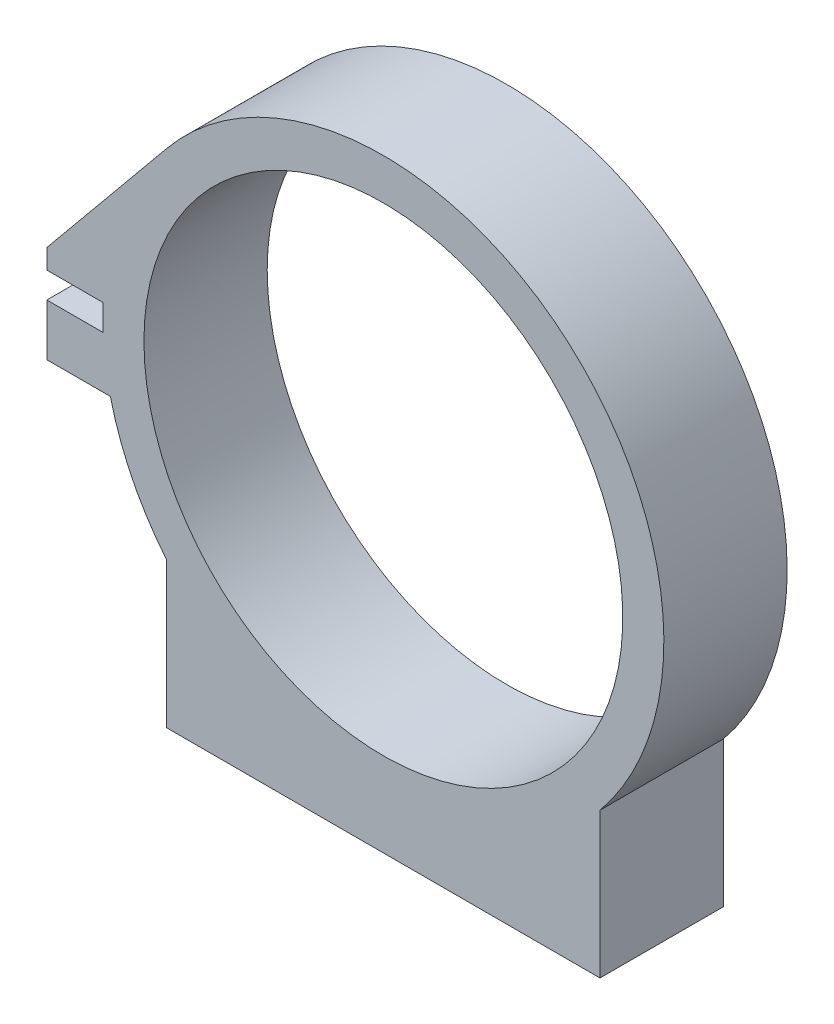
ISO-10303-21;
HEADER;
FILE_DESCRIPTION(('STEP AP214'),'2;1');
FILE_NAME('part.step','',(''),(''),'','','');
FILE_SCHEMA(('AUTOMOTIVE_DESIGN { 1 0 10303 214 1 1 1 1 }'));
ENDSEC;
DATA;
#1=APPLICATION_CONTEXT('core data for automotive mechanical design processes');
#2=APPLICATION_PROTOCOL_DEFINITION('international standard','automotive_design',2000,#1);
#3=PRODUCT_CONTEXT('',#1,'mechanical');
#4=PRODUCT('Part','Part','',(#3));
#5=PRODUCT_RELATED_PRODUCT_CATEGORY('part','',(#4));
#6=PRODUCT_DEFINITION_FORMATION('','',#4);
#7=PRODUCT_DEFINITION_CONTEXT('part definition',#1,'design');
#8=PRODUCT_DEFINITION('design','',#6,#7);
#9=PRODUCT_DEFINITION_SHAPE('','',#8);
#10=(LENGTH_UNIT() NAMED_UNIT(*) SI_UNIT(.MILLI.,.METRE.));
#11=(NAMED_UNIT(*) PLANE_ANGLE_UNIT() SI_UNIT($,.RADIAN.));
#12=(NAMED_UNIT(*) SI_UNIT($,.STERADIAN.) SOLID_ANGLE_UNIT());
#13=UNCERTAINTY_MEASURE_WITH_UNIT(LENGTH_MEASURE(1.E-05),#10,'distance_accuracy_value','');
#14=(GEOMETRIC_REPRESENTATION_CONTEXT(3) GLOBAL_UNCERTAINTY_ASSIGNED_CONTEXT((#13)) GLOBAL_UNIT_ASSIGNED_CONTEXT((#10,
#11,#12)) REPRESENTATION_CONTEXT('',''));
#15=CARTESIAN_POINT('',(0.,0.,0.));
#16=DIRECTION('',(0.,0.,1.));
#17=DIRECTION('',(1.,0.,0.));
#18=AXIS2_PLACEMENT_3D('',#15,#16,#17);
#19=CARTESIAN_POINT('',(0.,0.,9.525));
#20=DIRECTION('',(0.,0.,1.));
#21=DIRECTION('',(1.,0.,0.));
#22=AXIS2_PLACEMENT_3D('',#19,#20,#21);
#23=PLANE('',#22);
#24=CARTESIAN_POINT('',(0.,0.,9.525));
#25=DIRECTION('',(0.,0.,1.));
#26=DIRECTION('',(1.,0.,0.));
#27=AXIS2_PLACEMENT_3D('',#24,#25,#26);
#28=CIRCLE('',#27,21.675);
#29=CARTESIAN_POINT('',(-21.6519196608522,1.,9.525));
#30=VERTEX_POINT('',#29);
#31=CARTESIAN_POINT('',(-21.6519196608522,-1.,9.525));
#32=VERTEX_POINT('',#31);
#33=EDGE_CURVE('E178',#30,#32,#28,.T.);
#34=ORIENTED_EDGE('',*,*,#33,.T.);
#35=DIRECTION('',(-1.,0.,0.));
#36=VECTOR('',#35,1.);
#37=CARTESIAN_POINT('',(-26.,-1.,9.525));
#38=LINE('',#37,#36);
#39=CARTESIAN_POINT('',(-26.,-1.,9.525));
#40=VERTEX_POINT('',#39);
#41=EDGE_CURVE('E106',#32,#40,#38,.T.);
#42=ORIENTED_EDGE('',*,*,#41,.T.);
#43=DIRECTION('',(0.,-1.,0.));
#44=VECTOR('',#43,1.);
#45=CARTESIAN_POINT('',(-26.,-1.,9.525));
#46=LINE('',#45,#44);
#47=CARTESIAN_POINT('',(-26.,-5.,9.525));
#48=VERTEX_POINT('',#47);
#49=EDGE_CURVE('E206',#40,#48,#46,.T.);
#50=ORIENTED_EDGE('',*,*,#49,.T.);
#51=DIRECTION('',(1.,0.,0.));
#52=VECTOR('',#51,1.);
#53=CARTESIAN_POINT('',(-26.,-5.,9.525));
#54=LINE('',#53,#52);
#55=CARTESIAN_POINT('',(-21.0904154771783,-5.,9.525));
#56=VERTEX_POINT('',#55);
#57=EDGE_CURVE('E225',#48,#56,#54,.T.);
#58=ORIENTED_EDGE('',*,*,#57,.T.);
#59=CARTESIAN_POINT('',(0.,0.,9.525));
#60=DIRECTION('',(0.,0.,1.));
#61=DIRECTION('',(1.,0.,0.));
#62=AXIS2_PLACEMENT_3D('',#59,#60,#61);
#63=CIRCLE('',#62,21.675);
#64=CARTESIAN_POINT('',(-16.7386,-13.7704355428577,9.525));
#65=VERTEX_POINT('',#64);
#66=EDGE_CURVE('E222',#56,#65,#63,.T.);
#67=ORIENTED_EDGE('',*,*,#66,.T.);
#68=DIRECTION('',(0.,-1.,0.));
#69=VECTOR('',#68,1.);
#70=CARTESIAN_POINT('',(-16.7386,-13.7704355428577,9.525));
#71=LINE('',#70,#69);
#72=CARTESIAN_POINT('',(-16.7386,-25.,9.525));
#73=VERTEX_POINT('',#72);
#74=EDGE_CURVE('E224',#65,#73,#71,.T.);
#75=ORIENTED_EDGE('',*,*,#74,.T.);
#76=DIRECTION('',(1.,0.,0.));
#77=VECTOR('',#76,1.);
#78=CARTESIAN_POINT('',(-16.7386,-25.,9.525));
#79=LINE('',#78,#77);
#80=CARTESIAN_POINT('',(16.7386,-25.,9.525));
#81=VERTEX_POINT('',#80);
#82=EDGE_CURVE('E227',#73,#81,#79,.T.);
#83=ORIENTED_EDGE('',*,*,#82,.T.);
#84=DIRECTION('',(0.,1.,0.));
#85=VECTOR('',#84,1.);
#86=CARTESIAN_POINT('',(16.7386,-25.,9.525));
#87=LINE('',#86,#85);
#88=CARTESIAN_POINT('',(16.7386,-13.7704355428577,9.525));
#89=VERTEX_POINT('',#88);
#90=EDGE_CURVE('E233',#81,#89,#87,.T.);
#91=ORIENTED_EDGE('',*,*,#90,.T.);
#92=CARTESIAN_POINT('',(0.,0.,9.525));
#93=DIRECTION('',(0.,0.,1.));
#94=DIRECTION('',(1.,0.,0.));
#95=AXIS2_PLACEMENT_3D('',#92,#93,#94);
#96=CIRCLE('',#95,21.675);
#97=CARTESIAN_POINT('',(-16.7386,13.7704355428577,9.525));
#98=VERTEX_POINT('',#97);
#99=EDGE_CURVE('E137',#89,#98,#96,.T.);
#100=ORIENTED_EDGE('',*,*,#99,.T.);
#101=DIRECTION('',(-0.635314211896551,-0.772253748558247,0.));
#102=VECTOR('',#101,1.);
#103=CARTESIAN_POINT('',(-16.7386,13.7704355428577,9.525));
#104=LINE('',#103,#102);
#105=CARTESIAN_POINT('',(-26.,2.51277636733478,9.525));
#106=VERTEX_POINT('',#105);
#107=EDGE_CURVE('E131',#98,#106,#104,.T.);
#108=ORIENTED_EDGE('',*,*,#107,.T.);
#109=DIRECTION('',(0.,-1.,0.));
#110=VECTOR('',#109,1.);
#111=CARTESIAN_POINT('',(-26.,2.51277636733478,9.525));
#112=LINE('',#111,#110);
#113=CARTESIAN_POINT('',(-26.,1.,9.525));
#114=VERTEX_POINT('',#113);
#115=EDGE_CURVE('E135',#106,#114,#112,.T.);
#116=ORIENTED_EDGE('',*,*,#115,.T.);
#117=DIRECTION('',(1.,0.,0.));
#118=VECTOR('',#117,1.);
#119=CARTESIAN_POINT('',(-26.,1.,9.525));
#120=LINE('',#119,#118);
#121=EDGE_CURVE('E51',#114,#30,#120,.T.);
#122=ORIENTED_EDGE('',*,*,#121,.T.);
#123=EDGE_LOOP('',(#34,#42,#50,#58,#67,#75,#83,#91,#100,#108,#116,#122));
#124=FACE_BOUND('',#123,.T.);
#125=CARTESIAN_POINT('',(0.,0.,9.525));
#126=DIRECTION('',(0.,0.,1.));
#127=DIRECTION('',(1.,0.,0.));
#128=AXIS2_PLACEMENT_3D('',#125,#126,#127);
#129=CIRCLE('',#128,18.5);
#130=CARTESIAN_POINT('',(-18.5,0.,9.525));
#131=VERTEX_POINT('',#130);
#132=EDGE_CURVE('E159',#131,#131,#129,.T.);
#133=ORIENTED_EDGE('',*,*,#132,.F.);
#134=EDGE_LOOP('',(#133));
#135=FACE_BOUND('',#134,.T.);
#136=ADVANCED_FACE('F33',(#124,#135),#23,.T.);
#137=CARTESIAN_POINT('',(0.,0.,0.));
#138=DIRECTION('',(0.,0.,1.));
#139=DIRECTION('',(1.,0.,0.));
#140=AXIS2_PLACEMENT_3D('',#137,#138,#139);
#141=PLANE('',#140);
#142=CARTESIAN_POINT('',(0.,0.,0.));
#143=DIRECTION('',(0.,0.,1.));
#144=DIRECTION('',(1.,0.,0.));
#145=AXIS2_PLACEMENT_3D('',#142,#143,#144);
#146=CIRCLE('',#145,21.675);
#147=CARTESIAN_POINT('',(-21.6519196608522,1.,0.));
#148=VERTEX_POINT('',#147);
#149=CARTESIAN_POINT('',(-21.6519196608522,-1.,0.));
#150=VERTEX_POINT('',#149);
#151=EDGE_CURVE('E155',#148,#150,#146,.T.);
#152=ORIENTED_EDGE('',*,*,#151,.F.);
#153=DIRECTION('',(1.,0.,0.));
#154=VECTOR('',#153,1.);
#155=CARTESIAN_POINT('',(-26.,1.,0.));
#156=LINE('',#155,#154);
#157=CARTESIAN_POINT('',(-26.,1.,0.));
#158=VERTEX_POINT('',#157);
#159=EDGE_CURVE('E98',#158,#148,#156,.T.);
#160=ORIENTED_EDGE('',*,*,#159,.F.);
#161=DIRECTION('',(0.,-1.,0.));
#162=VECTOR('',#161,1.);
#163=CARTESIAN_POINT('',(-26.,2.51277636733478,0.));
#164=LINE('',#163,#162);
#165=CARTESIAN_POINT('',(-26.,2.51277636733478,0.));
#166=VERTEX_POINT('',#165);
#167=EDGE_CURVE('E92',#166,#158,#164,.T.);
#168=ORIENTED_EDGE('',*,*,#167,.F.);
#169=DIRECTION('',(-0.635314211896551,-0.772253748558247,0.));
#170=VECTOR('',#169,1.);
#171=CARTESIAN_POINT('',(-16.7386,13.7704355428577,0.));
#172=LINE('',#171,#170);
#173=CARTESIAN_POINT('',(-16.7386,13.7704355428577,0.));
#174=VERTEX_POINT('',#173);
#175=EDGE_CURVE('E145',#174,#166,#172,.T.);
#176=ORIENTED_EDGE('',*,*,#175,.F.);
#177=CARTESIAN_POINT('',(0.,0.,0.));
#178=DIRECTION('',(0.,0.,1.));
#179=DIRECTION('',(1.,0.,0.));
#180=AXIS2_PLACEMENT_3D('',#177,#178,#179);
#181=CIRCLE('',#180,21.675);
#182=CARTESIAN_POINT('',(16.7386,-13.7704355428577,0.));
#183=VERTEX_POINT('',#182);
#184=EDGE_CURVE('E173',#183,#174,#181,.T.);
#185=ORIENTED_EDGE('',*,*,#184,.F.);
#186=DIRECTION('',(0.,1.,0.));
#187=VECTOR('',#186,1.);
#188=CARTESIAN_POINT('',(16.7386,-25.,0.));
#189=LINE('',#188,#187);
#190=CARTESIAN_POINT('',(16.7386,-25.,0.));
#191=VERTEX_POINT('',#190);
#192=EDGE_CURVE('E171',#191,#183,#189,.T.);
#193=ORIENTED_EDGE('',*,*,#192,.F.);
#194=DIRECTION('',(1.,0.,0.));
#195=VECTOR('',#194,1.);
#196=CARTESIAN_POINT('',(-16.7386,-25.,0.));
#197=LINE('',#196,#195);
#198=CARTESIAN_POINT('',(-16.7386,-25.,0.));
#199=VERTEX_POINT('',#198);
#200=EDGE_CURVE('E169',#199,#191,#197,.T.);
#201=ORIENTED_EDGE('',*,*,#200,.F.);
#202=DIRECTION('',(0.,-1.,0.));
#203=VECTOR('',#202,1.);
#204=CARTESIAN_POINT('',(-16.7386,-13.7704355428577,0.));
#205=LINE('',#204,#203);
#206=CARTESIAN_POINT('',(-16.7386,-13.7704355428577,0.));
#207=VERTEX_POINT('',#206);
#208=EDGE_CURVE('E167',#207,#199,#205,.T.);
#209=ORIENTED_EDGE('',*,*,#208,.F.);
#210=CARTESIAN_POINT('',(0.,0.,0.));
#211=DIRECTION('',(0.,0.,1.));
#212=DIRECTION('',(1.,0.,0.));
#213=AXIS2_PLACEMENT_3D('',#210,#211,#212);
#214=CIRCLE('',#213,21.675);
#215=CARTESIAN_POINT('',(-21.0904154771783,-5.,0.));
#216=VERTEX_POINT('',#215);
#217=EDGE_CURVE('E165',#216,#207,#214,.T.);
#218=ORIENTED_EDGE('',*,*,#217,.F.);
#219=DIRECTION('',(1.,0.,0.));
#220=VECTOR('',#219,1.);
#221=CARTESIAN_POINT('',(-26.,-5.,0.));
#222=LINE('',#221,#220);
#223=CARTESIAN_POINT('',(-26.,-5.,0.));
#224=VERTEX_POINT('',#223);
#225=EDGE_CURVE('E163',#224,#216,#222,.T.);
#226=ORIENTED_EDGE('',*,*,#225,.F.);
#227=DIRECTION('',(0.,-1.,0.));
#228=VECTOR('',#227,1.);
#229=CARTESIAN_POINT('',(-26.,-1.,0.));
#230=LINE('',#229,#228);
#231=CARTESIAN_POINT('',(-26.,-1.,0.));
#232=VERTEX_POINT('',#231);
#233=EDGE_CURVE('E161',#232,#224,#230,.T.);
#234=ORIENTED_EDGE('',*,*,#233,.F.);
#235=DIRECTION('',(-1.,0.,0.));
#236=VECTOR('',#235,1.);
#237=CARTESIAN_POINT('',(-26.,-1.,0.));
#238=LINE('',#237,#236);
#239=EDGE_CURVE('E158',#150,#232,#238,.T.);
#240=ORIENTED_EDGE('',*,*,#239,.F.);
#241=EDGE_LOOP('',(#152,#160,#168,#176,#185,#193,#201,#209,#218,#226,#234,#240));
#242=FACE_BOUND('',#241,.T.);
#243=CARTESIAN_POINT('',(0.,0.,0.));
#244=DIRECTION('',(0.,0.,1.));
#245=DIRECTION('',(1.,0.,0.));
#246=AXIS2_PLACEMENT_3D('',#243,#244,#245);
#247=CIRCLE('',#246,18.5);
#248=CARTESIAN_POINT('',(-18.5,0.,0.));
#249=VERTEX_POINT('',#248);
#250=EDGE_CURVE('E311',#249,#249,#247,.T.);
#251=ORIENTED_EDGE('',*,*,#250,.T.);
#252=EDGE_LOOP('',(#251));
#253=FACE_BOUND('',#252,.T.);
#254=ADVANCED_FACE('F210',(#242,#253),#141,.F.);
#255=CARTESIAN_POINT('',(0.,0.,9.525));
#256=DIRECTION('',(0.,0.,-1.));
#257=DIRECTION('',(-1.,0.,0.));
#258=AXIS2_PLACEMENT_3D('',#255,#256,#257);
#259=CYLINDRICAL_SURFACE('',#258,21.675);
#260=ORIENTED_EDGE('',*,*,#151,.T.);
#261=DIRECTION('',(0.,0.,-1.));
#262=VECTOR('',#261,1.);
#263=CARTESIAN_POINT('',(-21.6519196608522,-1.,9.525));
#264=LINE('',#263,#262);
#265=EDGE_CURVE('E11',#32,#150,#264,.T.);
#266=ORIENTED_EDGE('',*,*,#265,.F.);
#267=ORIENTED_EDGE('',*,*,#33,.F.);
#268=DIRECTION('',(0.,0.,-1.));
#269=VECTOR('',#268,1.);
#270=CARTESIAN_POINT('',(-21.6519196608522,1.,9.525));
#271=LINE('',#270,#269);
#272=EDGE_CURVE('E151',#30,#148,#271,.T.);
#273=ORIENTED_EDGE('',*,*,#272,.T.);
#274=EDGE_LOOP('',(#260,#266,#267,#273));
#275=FACE_BOUND('',#274,.T.);
#276=ADVANCED_FACE('F35',(#275),#259,.T.);
#277=CARTESIAN_POINT('',(-26.,-1.,9.525));
#278=DIRECTION('',(0.,-1.,0.));
#279=DIRECTION('',(0.,0.,-1.));
#280=AXIS2_PLACEMENT_3D('',#277,#278,#279);
#281=PLANE('',#280);
#282=CARTESIAN_POINT('',(-23.5452077385891,-1.,4.7625));
#283=DIRECTION('',(0.,-1.,0.));
#284=DIRECTION('',(0.,0.,-1.));
#285=AXIS2_PLACEMENT_3D('',#282,#283,#284);
#286=CIRCLE('',#285,1.3890625);
#287=CARTESIAN_POINT('',(-23.5452077385891,-1.,3.3734375));
#288=VERTEX_POINT('',#287);
#289=EDGE_CURVE('E297',#288,#288,#286,.T.);
#290=ORIENTED_EDGE('',*,*,#289,.T.);
#291=EDGE_LOOP('',(#290));
#292=FACE_BOUND('',#291,.T.);
#293=ORIENTED_EDGE('',*,*,#239,.T.);
#294=DIRECTION('',(0.,0.,-1.));
#295=VECTOR('',#294,1.);
#296=CARTESIAN_POINT('',(-26.,-1.,9.525));
#297=LINE('',#296,#295);
#298=EDGE_CURVE('E43',#40,#232,#297,.T.);
#299=ORIENTED_EDGE('',*,*,#298,.F.);
#300=ORIENTED_EDGE('',*,*,#41,.F.);
#301=ORIENTED_EDGE('',*,*,#265,.T.);
#302=EDGE_LOOP('',(#293,#299,#300,#301));
#303=FACE_BOUND('',#302,.T.);
#304=ADVANCED_FACE('F350',(#292,#303),#281,.F.);
#305=CARTESIAN_POINT('',(-26.,-1.,9.525));
#306=DIRECTION('',(1.,0.,0.));
#307=DIRECTION('',(0.,0.,-1.));
#308=AXIS2_PLACEMENT_3D('',#305,#306,#307);
#309=PLANE('',#308);
#310=ORIENTED_EDGE('',*,*,#233,.T.);
#311=DIRECTION('',(0.,0.,-1.));
#312=VECTOR('',#311,1.);
#313=CARTESIAN_POINT('',(-26.,-5.,9.525));
#314=LINE('',#313,#312);
#315=EDGE_CURVE('E197',#48,#224,#314,.T.);
#316=ORIENTED_EDGE('',*,*,#315,.F.);
#317=ORIENTED_EDGE('',*,*,#49,.F.);
#318=ORIENTED_EDGE('',*,*,#298,.T.);
#319=EDGE_LOOP('',(#310,#316,#317,#318));
#320=FACE_BOUND('',#319,.T.);
#321=ADVANCED_FACE('F204',(#320),#309,.F.);
#322=CARTESIAN_POINT('',(-26.,-5.,9.525));
#323=DIRECTION('',(0.,1.,0.));
#324=DIRECTION('',(0.,0.,1.));
#325=AXIS2_PLACEMENT_3D('',#322,#323,#324);
#326=PLANE('',#325);
#327=CARTESIAN_POINT('',(-23.5452077385891,-5.,4.7625));
#328=DIRECTION('',(0.,-1.,0.));
#329=DIRECTION('',(0.,0.,-1.));
#330=AXIS2_PLACEMENT_3D('',#327,#328,#329);
#331=CIRCLE('',#330,1.3890625);
#332=CARTESIAN_POINT('',(-23.5452077385891,-5.,3.3734375));
#333=VERTEX_POINT('',#332);
#334=EDGE_CURVE('E294',#333,#333,#331,.T.);
#335=ORIENTED_EDGE('',*,*,#334,.F.);
#336=EDGE_LOOP('',(#335));
#337=FACE_BOUND('',#336,.T.);
#338=ORIENTED_EDGE('',*,*,#225,.T.);
#339=DIRECTION('',(0.,0.,-1.));
#340=VECTOR('',#339,1.);
#341=CARTESIAN_POINT('',(-21.0904154771783,-5.,9.525));
#342=LINE('',#341,#340);
#343=EDGE_CURVE('E194',#56,#216,#342,.T.);
#344=ORIENTED_EDGE('',*,*,#343,.F.);
#345=ORIENTED_EDGE('',*,*,#57,.F.);
#346=ORIENTED_EDGE('',*,*,#315,.T.);
#347=EDGE_LOOP('',(#338,#344,#345,#346));
#348=FACE_BOUND('',#347,.T.);
#349=ADVANCED_FACE('F216',(#337,#348),#326,.F.);
#350=CARTESIAN_POINT('',(0.,0.,9.525));
#351=DIRECTION('',(0.,0.,-1.));
#352=DIRECTION('',(-1.,0.,0.));
#353=AXIS2_PLACEMENT_3D('',#350,#351,#352);
#354=CYLINDRICAL_SURFACE('',#353,21.675);
#355=ORIENTED_EDGE('',*,*,#217,.T.);
#356=DIRECTION('',(0.,0.,-1.));
#357=VECTOR('',#356,1.);
#358=CARTESIAN_POINT('',(-16.7386,-13.7704355428577,9.525));
#359=LINE('',#358,#357);
#360=EDGE_CURVE('E191',#65,#207,#359,.T.);
#361=ORIENTED_EDGE('',*,*,#360,.F.);
#362=ORIENTED_EDGE('',*,*,#66,.F.);
#363=ORIENTED_EDGE('',*,*,#343,.T.);
#364=EDGE_LOOP('',(#355,#361,#362,#363));
#365=FACE_BOUND('',#364,.T.);
#366=ADVANCED_FACE('F220',(#365),#354,.T.);
#367=CARTESIAN_POINT('',(-16.7386,-13.7704355428577,9.525));
#368=DIRECTION('',(1.,0.,0.));
#369=DIRECTION('',(0.,1.,0.));
#370=AXIS2_PLACEMENT_3D('',#367,#368,#369);
#371=PLANE('',#370);
#372=ORIENTED_EDGE('',*,*,#208,.T.);
#373=DIRECTION('',(0.,0.,-1.));
#374=VECTOR('',#373,1.);
#375=CARTESIAN_POINT('',(-16.7386,-25.,9.525));
#376=LINE('',#375,#374);
#377=EDGE_CURVE('E188',#73,#199,#376,.T.);
#378=ORIENTED_EDGE('',*,*,#377,.F.);
#379=ORIENTED_EDGE('',*,*,#74,.F.);
#380=ORIENTED_EDGE('',*,*,#360,.T.);
#381=EDGE_LOOP('',(#372,#378,#379,#380));
#382=FACE_BOUND('',#381,.T.);
#383=ADVANCED_FACE('F332',(#382),#371,.F.);
#384=CARTESIAN_POINT('',(-16.7386,-25.,9.525));
#385=DIRECTION('',(0.,1.,0.));
#386=DIRECTION('',(0.,0.,1.));
#387=AXIS2_PLACEMENT_3D('',#384,#385,#386);
#388=PLANE('',#387);
#389=CARTESIAN_POINT('',(-13.4747,-25.,4.7625));
#390=DIRECTION('',(0.,-1.,0.));
#391=DIRECTION('',(0.,0.,-1.));
#392=AXIS2_PLACEMENT_3D('',#389,#390,#391);
#393=CIRCLE('',#392,1.3890625);
#394=CARTESIAN_POINT('',(-13.4747,-25.,3.3734375));
#395=VERTEX_POINT('',#394);
#396=EDGE_CURVE('E312',#395,#395,#393,.T.);
#397=ORIENTED_EDGE('',*,*,#396,.F.);
#398=EDGE_LOOP('',(#397));
#399=FACE_BOUND('',#398,.T.);
#400=CARTESIAN_POINT('',(13.4747,-25.,4.7625));
#401=DIRECTION('',(0.,-1.,0.));
#402=DIRECTION('',(0.,0.,-1.));
#403=AXIS2_PLACEMENT_3D('',#400,#401,#402);
#404=CIRCLE('',#403,1.3890625);
#405=CARTESIAN_POINT('',(13.4747,-25.,3.3734375));
#406=VERTEX_POINT('',#405);
#407=EDGE_CURVE('E299',#406,#406,#404,.T.);
#408=ORIENTED_EDGE('',*,*,#407,.F.);
#409=EDGE_LOOP('',(#408));
#410=FACE_BOUND('',#409,.T.);
#411=ORIENTED_EDGE('',*,*,#200,.T.);
#412=DIRECTION('',(0.,0.,-1.));
#413=VECTOR('',#412,1.);
#414=CARTESIAN_POINT('',(16.7386,-25.,9.525));
#415=LINE('',#414,#413);
#416=EDGE_CURVE('E185',#81,#191,#415,.T.);
#417=ORIENTED_EDGE('',*,*,#416,.F.);
#418=ORIENTED_EDGE('',*,*,#82,.F.);
#419=ORIENTED_EDGE('',*,*,#377,.T.);
#420=EDGE_LOOP('',(#411,#417,#418,#419));
#421=FACE_BOUND('',#420,.T.);
#422=ADVANCED_FACE('F329',(#399,#410,#421),#388,.F.);
#423=CARTESIAN_POINT('',(16.7386,-25.,9.525));
#424=DIRECTION('',(-1.,0.,0.));
#425=DIRECTION('',(0.,-1.,0.));
#426=AXIS2_PLACEMENT_3D('',#423,#424,#425);
#427=PLANE('',#426);
#428=ORIENTED_EDGE('',*,*,#192,.T.);
#429=DIRECTION('',(0.,0.,-1.));
#430=VECTOR('',#429,1.);
#431=CARTESIAN_POINT('',(16.7386,-13.7704355428577,9.525));
#432=LINE('',#431,#430);
#433=EDGE_CURVE('E182',#89,#183,#432,.T.);
#434=ORIENTED_EDGE('',*,*,#433,.F.);
#435=ORIENTED_EDGE('',*,*,#90,.F.);
#436=ORIENTED_EDGE('',*,*,#416,.T.);
#437=EDGE_LOOP('',(#428,#434,#435,#436));
#438=FACE_BOUND('',#437,.T.);
#439=ADVANCED_FACE('F239',(#438),#427,.F.);
#440=CARTESIAN_POINT('',(0.,0.,9.525));
#441=DIRECTION('',(0.,0.,-1.));
#442=DIRECTION('',(-1.,0.,0.));
#443=AXIS2_PLACEMENT_3D('',#440,#441,#442);
#444=CYLINDRICAL_SURFACE('',#443,21.675);
#445=ORIENTED_EDGE('',*,*,#184,.T.);
#446=DIRECTION('',(0.,0.,-1.));
#447=VECTOR('',#446,1.);
#448=CARTESIAN_POINT('',(-16.7386,13.7704355428577,9.525));
#449=LINE('',#448,#447);
#450=EDGE_CURVE('E146',#98,#174,#449,.T.);
#451=ORIENTED_EDGE('',*,*,#450,.F.);
#452=ORIENTED_EDGE('',*,*,#99,.F.);
#453=ORIENTED_EDGE('',*,*,#433,.T.);
#454=EDGE_LOOP('',(#445,#451,#452,#453));
#455=FACE_BOUND('',#454,.T.);
#456=ADVANCED_FACE('F243',(#455),#444,.T.);
#457=CARTESIAN_POINT('',(-16.7386,13.7704355428577,9.525));
#458=DIRECTION('',(0.772253748558247,-0.635314211896551,0.));
#459=DIRECTION('',(0.635314211896551,0.772253748558247,0.));
#460=AXIS2_PLACEMENT_3D('',#457,#458,#459);
#461=PLANE('',#460);
#462=CARTESIAN_POINT('',(-23.5452077385891,5.49668966615299,4.7625));
#463=DIRECTION('',(0.772253748558247,-0.635314211896551,0.));
#464=DIRECTION('',(-0.635314211896551,-0.772253748558247,0.));
#465=AXIS2_PLACEMENT_3D('',#462,#463,#464);
#466=ELLIPSE('',#465,2.18641811246965,1.3890625);
#467=CARTESIAN_POINT('',(-24.9342702385891,3.80822008288265,4.7625));
#468=VERTEX_POINT('',#467);
#469=EDGE_CURVE('E304',#468,#468,#466,.F.);
#470=ORIENTED_EDGE('',*,*,#469,.F.);
#471=EDGE_LOOP('',(#470));
#472=FACE_BOUND('',#471,.T.);
#473=ORIENTED_EDGE('',*,*,#175,.T.);
#474=DIRECTION('',(0.,0.,-1.));
#475=VECTOR('',#474,1.);
#476=CARTESIAN_POINT('',(-26.,2.51277636733478,9.525));
#477=LINE('',#476,#475);
#478=EDGE_CURVE('E142',#106,#166,#477,.T.);
#479=ORIENTED_EDGE('',*,*,#478,.F.);
#480=ORIENTED_EDGE('',*,*,#107,.F.);
#481=ORIENTED_EDGE('',*,*,#450,.T.);
#482=EDGE_LOOP('',(#473,#479,#480,#481));
#483=FACE_BOUND('',#482,.T.);
#484=ADVANCED_FACE('F143',(#472,#483),#461,.F.);
#485=CARTESIAN_POINT('',(-26.,2.51277636733478,9.525));
#486=DIRECTION('',(1.,0.,0.));
#487=DIRECTION('',(0.,0.,-1.));
#488=AXIS2_PLACEMENT_3D('',#485,#486,#487);
#489=PLANE('',#488);
#490=ORIENTED_EDGE('',*,*,#167,.T.);
#491=DIRECTION('',(0.,0.,-1.));
#492=VECTOR('',#491,1.);
#493=CARTESIAN_POINT('',(-26.,1.,9.525));
#494=LINE('',#493,#492);
#495=EDGE_CURVE('E147',#114,#158,#494,.T.);
#496=ORIENTED_EDGE('',*,*,#495,.F.);
#497=ORIENTED_EDGE('',*,*,#115,.F.);
#498=ORIENTED_EDGE('',*,*,#478,.T.);
#499=EDGE_LOOP('',(#490,#496,#497,#498));
#500=FACE_BOUND('',#499,.T.);
#501=ADVANCED_FACE('F149',(#500),#489,.F.);
#502=CARTESIAN_POINT('',(-26.,1.,9.525));
#503=DIRECTION('',(0.,1.,0.));
#504=DIRECTION('',(0.,0.,1.));
#505=AXIS2_PLACEMENT_3D('',#502,#503,#504);
#506=PLANE('',#505);
#507=CARTESIAN_POINT('',(-23.5452077385891,1.,4.7625));
#508=DIRECTION('',(0.,1.,0.));
#509=DIRECTION('',(0.,0.,1.));
#510=AXIS2_PLACEMENT_3D('',#507,#508,#509);
#511=CIRCLE('',#510,1.3890625);
#512=CARTESIAN_POINT('',(-23.5452077385891,1.,6.1515625));
#513=VERTEX_POINT('',#512);
#514=EDGE_CURVE('E37',#513,#513,#511,.T.);
#515=ORIENTED_EDGE('',*,*,#514,.T.);
#516=EDGE_LOOP('',(#515));
#517=FACE_BOUND('',#516,.T.);
#518=ORIENTED_EDGE('',*,*,#159,.T.);
#519=ORIENTED_EDGE('',*,*,#272,.F.);
#520=ORIENTED_EDGE('',*,*,#121,.F.);
#521=ORIENTED_EDGE('',*,*,#495,.T.);
#522=EDGE_LOOP('',(#518,#519,#520,#521));
#523=FACE_BOUND('',#522,.T.);
#524=ADVANCED_FACE('F247',(#517,#523),#506,.F.);
#525=CARTESIAN_POINT('',(0.,0.,9.525));
#526=DIRECTION('',(0.,0.,-1.));
#527=DIRECTION('',(-1.,0.,0.));
#528=AXIS2_PLACEMENT_3D('',#525,#526,#527);
#529=CYLINDRICAL_SURFACE('',#528,18.5);
#530=CARTESIAN_POINT('',(-18.5,0.,9.525));
#531=CARTESIAN_POINT('',(-18.5,0.,9.42578125));
#532=CARTESIAN_POINT('',(-18.5,0.,9.3265625));
#533=CARTESIAN_POINT('',(-18.5,0.,9.128125));
#534=CARTESIAN_POINT('',(-18.5,0.,9.02890625));
#535=CARTESIAN_POINT('',(-18.5,0.,8.83046875));
#536=CARTESIAN_POINT('',(-18.5,0.,8.73125));
#537=CARTESIAN_POINT('',(-18.5,0.,8.5328125));
#538=CARTESIAN_POINT('',(-18.5,0.,8.43359375));
#539=CARTESIAN_POINT('',(-18.5,0.,8.23515625));
#540=CARTESIAN_POINT('',(-18.5,0.,8.1359375));
#541=CARTESIAN_POINT('',(-18.5,0.,7.9375));
#542=CARTESIAN_POINT('',(-18.5,0.,7.83828125));
#543=CARTESIAN_POINT('',(-18.5,0.,7.63984375));
#544=CARTESIAN_POINT('',(-18.5,0.,7.540625));
#545=CARTESIAN_POINT('',(-18.5,0.,7.3421875));
#546=CARTESIAN_POINT('',(-18.5,0.,7.24296875));
#547=CARTESIAN_POINT('',(-18.5,0.,7.04453125));
#548=CARTESIAN_POINT('',(-18.5,0.,6.9453125));
#549=CARTESIAN_POINT('',(-18.5,0.,6.746875));
#550=CARTESIAN_POINT('',(-18.5,0.,6.64765625));
#551=CARTESIAN_POINT('',(-18.5,0.,6.44921875));
#552=CARTESIAN_POINT('',(-18.5,0.,6.35));
#553=CARTESIAN_POINT('',(-18.5,0.,6.1515625));
#554=CARTESIAN_POINT('',(-18.5,0.,6.05234375));
#555=CARTESIAN_POINT('',(-18.5,0.,5.85390625));
#556=CARTESIAN_POINT('',(-18.5,0.,5.7546875));
#557=CARTESIAN_POINT('',(-18.5,0.,5.55625));
#558=CARTESIAN_POINT('',(-18.5,0.,5.45703125));
#559=CARTESIAN_POINT('',(-18.5,0.,5.25859375));
#560=CARTESIAN_POINT('',(-18.5,0.,5.159375));
#561=CARTESIAN_POINT('',(-18.5,0.,4.9609375));
#562=CARTESIAN_POINT('',(-18.5,0.,4.86171875));
#563=CARTESIAN_POINT('',(-18.5,0.,4.66328125));
#564=CARTESIAN_POINT('',(-18.5,0.,4.5640625));
#565=CARTESIAN_POINT('',(-18.5,0.,4.365625));
#566=CARTESIAN_POINT('',(-18.5,0.,4.26640625));
#567=CARTESIAN_POINT('',(-18.5,0.,4.06796875));
#568=CARTESIAN_POINT('',(-18.5,0.,3.96875));
#569=CARTESIAN_POINT('',(-18.5,0.,3.7703125));
#570=CARTESIAN_POINT('',(-18.5,0.,3.67109375));
#571=CARTESIAN_POINT('',(-18.5,0.,3.47265625));
#572=CARTESIAN_POINT('',(-18.5,0.,3.3734375));
#573=CARTESIAN_POINT('',(-18.5,0.,3.175));
#574=CARTESIAN_POINT('',(-18.5,0.,3.07578125));
#575=CARTESIAN_POINT('',(-18.5,0.,2.87734375));
#576=CARTESIAN_POINT('',(-18.5,0.,2.778125));
#577=CARTESIAN_POINT('',(-18.5,0.,2.5796875));
#578=CARTESIAN_POINT('',(-18.5,0.,2.48046875));
#579=CARTESIAN_POINT('',(-18.5,0.,2.28203125));
#580=CARTESIAN_POINT('',(-18.5,0.,2.1828125));
#581=CARTESIAN_POINT('',(-18.5,0.,1.984375));
#582=CARTESIAN_POINT('',(-18.5,0.,1.88515625));
#583=CARTESIAN_POINT('',(-18.5,0.,1.68671875));
#584=CARTESIAN_POINT('',(-18.5,0.,1.5875));
#585=CARTESIAN_POINT('',(-18.5,0.,1.3890625));
#586=CARTESIAN_POINT('',(-18.5,0.,1.28984375));
#587=CARTESIAN_POINT('',(-18.5,0.,1.09140625));
#588=CARTESIAN_POINT('',(-18.5,0.,0.992187500000001));
#589=CARTESIAN_POINT('',(-18.5,0.,0.793750000000001));
#590=CARTESIAN_POINT('',(-18.5,0.,0.69453125));
#591=CARTESIAN_POINT('',(-18.5,0.,0.49609375));
#592=CARTESIAN_POINT('',(-18.5,0.,0.396875));
#593=CARTESIAN_POINT('',(-18.5,0.,0.1984375));
#594=CARTESIAN_POINT('',(-18.5,0.,0.0992187500000001));
#595=CARTESIAN_POINT('',(-18.5,0.,0.));
#596=B_SPLINE_CURVE_WITH_KNOTS('',3,(#530,#531,#532,#533,#534,#535,#536,#537,#538,#539,#540,
#541,#542,#543,#544,#545,#546,#547,#548,#549,#550,#551,#552,#553,#554,#555,#556,#557,#558,#559,
#560,#561,#562,#563,#564,#565,#566,#567,#568,#569,#570,#571,#572,#573,#574,#575,#576,#577,#578,
#579,#580,#581,#582,#583,#584,#585,#586,#587,#588,#589,#590,#591,#592,#593,#594,#595),
.UNSPECIFIED.,.F.,.F.,(4,2,2,2,2,2,2,2,2,2,2,2,2,2,2,2,2,2,2,2,2,2,2,2,2,2,2,2,2,2,2,2,4),(0.,
0.29765625,0.5953125,0.892968750000001,1.190625,1.48828125,1.7859375,2.08359375,2.38125,
2.67890625,2.9765625,3.27421875,3.571875,3.86953125,4.1671875,4.46484375,4.7625,5.06015625,
5.3578125,5.65546875,5.953125,6.25078125,6.5484375,6.84609375,7.14375,7.44140625,7.7390625,
8.03671875,8.334375,8.63203125,8.9296875,9.22734375,9.525),.UNSPECIFIED.);
#597=EDGE_CURVE('BSEAM249',#131,#249,#596,.T.);
#598=ORIENTED_EDGE('',*,*,#132,.T.);
#599=ORIENTED_EDGE('',*,*,#250,.F.);
#600=ORIENTED_EDGE('',*,*,#597,.T.);
#601=ORIENTED_EDGE('',*,*,#597,.F.);
#602=EDGE_LOOP('',(#598,#600,#599,#601));
#603=FACE_BOUND('',#602,.T.);
#604=ADVANCED_FACE('F249',(#603),#529,.F.);
#605=CARTESIAN_POINT('',(13.4747,-18.65,4.7625));
#606=DIRECTION('',(0.,-1.,0.));
#607=DIRECTION('',(0.,0.,-1.));
#608=AXIS2_PLACEMENT_3D('',#605,#606,#607);
#609=CYLINDRICAL_SURFACE('',#608,1.3890625);
#610=CARTESIAN_POINT('',(13.4747,-18.65,4.7625));
#611=DIRECTION('',(0.,-1.,0.));
#612=DIRECTION('',(0.,0.,-1.));
#613=AXIS2_PLACEMENT_3D('',#610,#611,#612);
#614=CIRCLE('',#613,1.3890625);
#615=CARTESIAN_POINT('',(13.4747,-18.65,3.3734375));
#616=VERTEX_POINT('',#615);
#617=EDGE_CURVE('E302',#616,#616,#614,.T.);
#618=ORIENTED_EDGE('',*,*,#617,.F.);
#619=EDGE_LOOP('',(#618));
#620=FACE_BOUND('',#619,.T.);
#621=ORIENTED_EDGE('',*,*,#407,.T.);
#622=EDGE_LOOP('',(#621));
#623=FACE_BOUND('',#622,.T.);
#624=ADVANCED_FACE('F256',(#620,#623),#609,.F.);
#625=CARTESIAN_POINT('',(13.4747,-18.65,4.7625));
#626=DIRECTION('',(0.,-1.,0.));
#627=DIRECTION('',(0.,0.,-1.));
#628=AXIS2_PLACEMENT_3D('',#625,#626,#627);
#629=PLANE('',#628);
#630=ORIENTED_EDGE('',*,*,#617,.T.);
#631=EDGE_LOOP('',(#630));
#632=FACE_BOUND('',#631,.T.);
#633=ADVANCED_FACE('F270',(#632),#629,.T.);
#634=CARTESIAN_POINT('',(-13.4747,-18.65,4.7625));
#635=DIRECTION('',(0.,-1.,0.));
#636=DIRECTION('',(0.,0.,-1.));
#637=AXIS2_PLACEMENT_3D('',#634,#635,#636);
#638=CYLINDRICAL_SURFACE('',#637,1.3890625);
#639=CARTESIAN_POINT('',(-13.4747,-18.65,4.7625));
#640=DIRECTION('',(0.,-1.,0.));
#641=DIRECTION('',(0.,0.,-1.));
#642=AXIS2_PLACEMENT_3D('',#639,#640,#641);
#643=CIRCLE('',#642,1.3890625);
#644=CARTESIAN_POINT('',(-13.4747,-18.65,3.3734375));
#645=VERTEX_POINT('',#644);
#646=EDGE_CURVE('E308',#645,#645,#643,.T.);
#647=ORIENTED_EDGE('',*,*,#646,.F.);
#648=EDGE_LOOP('',(#647));
#649=FACE_BOUND('',#648,.T.);
#650=ORIENTED_EDGE('',*,*,#396,.T.);
#651=EDGE_LOOP('',(#650));
#652=FACE_BOUND('',#651,.T.);
#653=ADVANCED_FACE('F274',(#649,#652),#638,.F.);
#654=CARTESIAN_POINT('',(-13.4747,-18.65,4.7625));
#655=DIRECTION('',(0.,-1.,0.));
#656=DIRECTION('',(0.,0.,-1.));
#657=AXIS2_PLACEMENT_3D('',#654,#655,#656);
#658=PLANE('',#657);
#659=ORIENTED_EDGE('',*,*,#646,.T.);
#660=EDGE_LOOP('',(#659));
#661=FACE_BOUND('',#660,.T.);
#662=ADVANCED_FACE('F278',(#661),#658,.T.);
#663=CARTESIAN_POINT('',(-23.5452077385891,10.5531828403096,4.7625));
#664=DIRECTION('',(0.,-1.,0.));
#665=DIRECTION('',(0.,0.,-1.));
#666=AXIS2_PLACEMENT_3D('',#663,#664,#665);
#667=CYLINDRICAL_SURFACE('',#666,1.3890625);
#668=ORIENTED_EDGE('',*,*,#469,.T.);
#669=EDGE_LOOP('',(#668));
#670=FACE_BOUND('',#669,.T.);
#671=ORIENTED_EDGE('',*,*,#514,.F.);
#672=EDGE_LOOP('',(#671));
#673=FACE_BOUND('',#672,.T.);
#674=ADVANCED_FACE('F282',(#670,#673),#667,.F.);
#675=ORIENTED_EDGE('',*,*,#334,.T.);
#676=EDGE_LOOP('',(#675));
#677=FACE_BOUND('',#676,.T.);
#678=ORIENTED_EDGE('',*,*,#289,.F.);
#679=EDGE_LOOP('',(#678));
#680=FACE_BOUND('',#679,.T.);
#681=ADVANCED_FACE('F284',(#677,#680),#667,.F.);
#682=CLOSED_SHELL('',(#136,#254,#276,#304,#321,#349,#366,#383,#422,#439,#456,#484,#501,#524,
#604,#624,#633,#653,#662,#674,#681));
#683=MANIFOLD_SOLID_BREP('B2',#682);
#684=ADVANCED_BREP_SHAPE_REPRESENTATION('',(#18,#683),#14);
#685=SHAPE_DEFINITION_REPRESENTATION(#9,#684);
ENDSEC;
END-ISO-10303-21;
